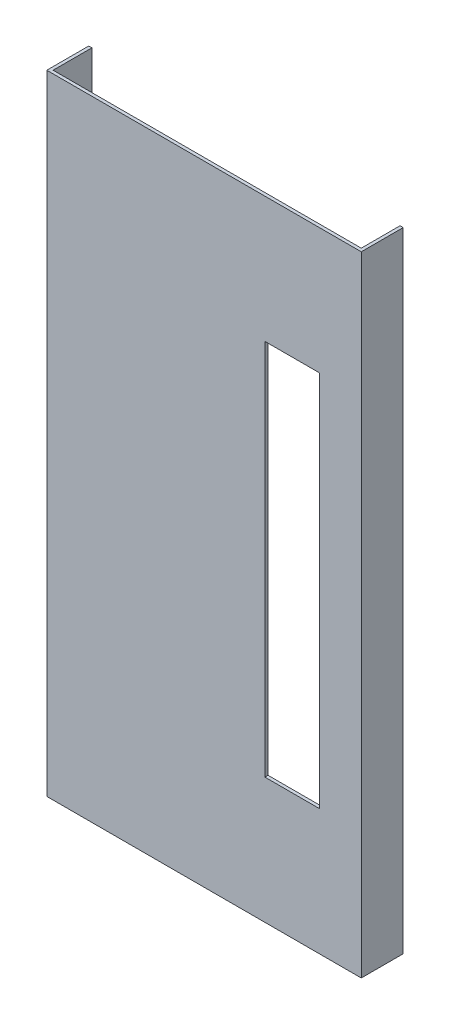
ISO-10303-21;
HEADER;
FILE_DESCRIPTION(('STEP AP214'),'2;1');
FILE_NAME('part.step','',(''),(''),'','','');
FILE_SCHEMA(('AUTOMOTIVE_DESIGN { 1 0 10303 214 1 1 1 1 }'));
ENDSEC;
DATA;
#1=APPLICATION_CONTEXT('core data for automotive mechanical design processes');
#2=APPLICATION_PROTOCOL_DEFINITION('international standard','automotive_design',2000,#1);
#3=PRODUCT_CONTEXT('',#1,'mechanical');
#4=PRODUCT('Part','Part','',(#3));
#5=PRODUCT_RELATED_PRODUCT_CATEGORY('part','',(#4));
#6=PRODUCT_DEFINITION_FORMATION('','',#4);
#7=PRODUCT_DEFINITION_CONTEXT('part definition',#1,'design');
#8=PRODUCT_DEFINITION('design','',#6,#7);
#9=PRODUCT_DEFINITION_SHAPE('','',#8);
#10=(LENGTH_UNIT() NAMED_UNIT(*) SI_UNIT(.MILLI.,.METRE.));
#11=(NAMED_UNIT(*) PLANE_ANGLE_UNIT() SI_UNIT($,.RADIAN.));
#12=(NAMED_UNIT(*) SI_UNIT($,.STERADIAN.) SOLID_ANGLE_UNIT());
#13=UNCERTAINTY_MEASURE_WITH_UNIT(LENGTH_MEASURE(1.E-05),#10,'distance_accuracy_value','');
#14=(GEOMETRIC_REPRESENTATION_CONTEXT(3) GLOBAL_UNCERTAINTY_ASSIGNED_CONTEXT((#13)) GLOBAL_UNIT_ASSIGNED_CONTEXT((#10,
#11,#12)) REPRESENTATION_CONTEXT('',''));
#15=CARTESIAN_POINT('',(0.,0.,0.));
#16=DIRECTION('',(0.,0.,1.));
#17=DIRECTION('',(1.,0.,0.));
#18=AXIS2_PLACEMENT_3D('',#15,#16,#17);
#19=CARTESIAN_POINT('',(180.,1120.,40.));
#20=DIRECTION('',(0.,0.,-1.));
#21=DIRECTION('',(-1.,0.,0.));
#22=AXIS2_PLACEMENT_3D('',#19,#20,#21);
#23=PLANE('',#22);
#24=DIRECTION('',(1.,0.,0.));
#25=VECTOR('',#24,1.);
#26=CARTESIAN_POINT('',(180.,820.,40.));
#27=LINE('',#26,#25);
#28=CARTESIAN_POINT('',(30.,820.,40.));
#29=VERTEX_POINT('',#28);
#30=CARTESIAN_POINT('',(180.,820.,40.));
#31=VERTEX_POINT('',#30);
#32=EDGE_CURVE('E141',#29,#31,#27,.T.);
#33=ORIENTED_EDGE('',*,*,#32,.T.);
#34=DIRECTION('',(0.,-1.,0.));
#35=VECTOR('',#34,1.);
#36=CARTESIAN_POINT('',(180.,1120.,40.));
#37=LINE('',#36,#35);
#38=CARTESIAN_POINT('',(180.,1120.,40.));
#39=VERTEX_POINT('',#38);
#40=EDGE_CURVE('E200',#39,#31,#37,.T.);
#41=ORIENTED_EDGE('',*,*,#40,.F.);
#42=DIRECTION('',(1.,0.,0.));
#43=VECTOR('',#42,1.);
#44=CARTESIAN_POINT('',(180.,1120.,40.));
#45=LINE('',#44,#43);
#46=CARTESIAN_POINT('',(30.,1120.,40.));
#47=VERTEX_POINT('',#46);
#48=EDGE_CURVE('E149',#47,#39,#45,.T.);
#49=ORIENTED_EDGE('',*,*,#48,.F.);
#50=DIRECTION('',(0.,-1.,0.));
#51=VECTOR('',#50,1.);
#52=CARTESIAN_POINT('',(30.,1120.,40.));
#53=LINE('',#52,#51);
#54=EDGE_CURVE('E166',#47,#29,#53,.T.);
#55=ORIENTED_EDGE('',*,*,#54,.T.);
#56=EDGE_LOOP('',(#33,#41,#49,#55));
#57=FACE_BOUND('',#56,.T.);
#58=DIRECTION('',(0.,-1.,0.));
#59=VECTOR('',#58,1.);
#60=CARTESIAN_POINT('',(134.,1120.,40.));
#61=LINE('',#60,#59);
#62=CARTESIAN_POINT('',(134.,1060.,40.));
#63=VERTEX_POINT('',#62);
#64=CARTESIAN_POINT('',(134.,880.,40.));
#65=VERTEX_POINT('',#64);
#66=EDGE_CURVE('E134',#63,#65,#61,.T.);
#67=ORIENTED_EDGE('',*,*,#66,.F.);
#68=DIRECTION('',(-1.,0.,0.));
#69=VECTOR('',#68,1.);
#70=CARTESIAN_POINT('',(180.,1060.,40.));
#71=LINE('',#70,#69);
#72=CARTESIAN_POINT('',(160.,1060.,40.));
#73=VERTEX_POINT('',#72);
#74=EDGE_CURVE('E123',#73,#63,#71,.T.);
#75=ORIENTED_EDGE('',*,*,#74,.F.);
#76=DIRECTION('',(0.,1.,0.));
#77=VECTOR('',#76,1.);
#78=CARTESIAN_POINT('',(160.,1120.,40.));
#79=LINE('',#78,#77);
#80=CARTESIAN_POINT('',(160.,880.,40.));
#81=VERTEX_POINT('',#80);
#82=EDGE_CURVE('E128',#81,#73,#79,.T.);
#83=ORIENTED_EDGE('',*,*,#82,.F.);
#84=DIRECTION('',(1.,0.,0.));
#85=VECTOR('',#84,1.);
#86=CARTESIAN_POINT('',(180.,880.,40.));
#87=LINE('',#86,#85);
#88=EDGE_CURVE('E140',#65,#81,#87,.T.);
#89=ORIENTED_EDGE('',*,*,#88,.F.);
#90=EDGE_LOOP('',(#67,#75,#83,#89));
#91=FACE_BOUND('',#90,.T.);
#92=ADVANCED_FACE('F39',(#57,#91),#23,.F.);
#93=CARTESIAN_POINT('',(31.5,1120.,38.5));
#94=DIRECTION('',(0.,0.,1.));
#95=DIRECTION('',(1.,0.,0.));
#96=AXIS2_PLACEMENT_3D('',#93,#94,#95);
#97=PLANE('',#96);
#98=DIRECTION('',(-1.,0.,0.));
#99=VECTOR('',#98,1.);
#100=CARTESIAN_POINT('',(31.5,820.,38.5));
#101=LINE('',#100,#99);
#102=CARTESIAN_POINT('',(178.5,820.,38.5));
#103=VERTEX_POINT('',#102);
#104=CARTESIAN_POINT('',(31.5,820.,38.5));
#105=VERTEX_POINT('',#104);
#106=EDGE_CURVE('E173',#103,#105,#101,.T.);
#107=ORIENTED_EDGE('',*,*,#106,.T.);
#108=DIRECTION('',(0.,-1.,0.));
#109=VECTOR('',#108,1.);
#110=CARTESIAN_POINT('',(31.5,1120.,38.5));
#111=LINE('',#110,#109);
#112=CARTESIAN_POINT('',(31.5,1120.,38.5));
#113=VERTEX_POINT('',#112);
#114=EDGE_CURVE('E188',#113,#105,#111,.T.);
#115=ORIENTED_EDGE('',*,*,#114,.F.);
#116=DIRECTION('',(-1.,0.,0.));
#117=VECTOR('',#116,1.);
#118=CARTESIAN_POINT('',(31.5,1120.,38.5));
#119=LINE('',#118,#117);
#120=CARTESIAN_POINT('',(178.5,1120.,38.5));
#121=VERTEX_POINT('',#120);
#122=EDGE_CURVE('E159',#121,#113,#119,.T.);
#123=ORIENTED_EDGE('',*,*,#122,.F.);
#124=DIRECTION('',(0.,-1.,0.));
#125=VECTOR('',#124,1.);
#126=CARTESIAN_POINT('',(178.5,1120.,38.5));
#127=LINE('',#126,#125);
#128=EDGE_CURVE('E191',#121,#103,#127,.T.);
#129=ORIENTED_EDGE('',*,*,#128,.T.);
#130=EDGE_LOOP('',(#107,#115,#123,#129));
#131=FACE_BOUND('',#130,.T.);
#132=DIRECTION('',(0.,1.,0.));
#133=VECTOR('',#132,1.);
#134=CARTESIAN_POINT('',(134.,1120.,38.5));
#135=LINE('',#134,#133);
#136=CARTESIAN_POINT('',(134.,880.,38.5));
#137=VERTEX_POINT('',#136);
#138=CARTESIAN_POINT('',(134.,1060.,38.5));
#139=VERTEX_POINT('',#138);
#140=EDGE_CURVE('E11',#137,#139,#135,.T.);
#141=ORIENTED_EDGE('',*,*,#140,.F.);
#142=DIRECTION('',(-1.,0.,0.));
#143=VECTOR('',#142,1.);
#144=CARTESIAN_POINT('',(31.5,880.,38.5));
#145=LINE('',#144,#143);
#146=CARTESIAN_POINT('',(160.,880.,38.5));
#147=VERTEX_POINT('',#146);
#148=EDGE_CURVE('E46',#147,#137,#145,.T.);
#149=ORIENTED_EDGE('',*,*,#148,.F.);
#150=DIRECTION('',(0.,-1.,0.));
#151=VECTOR('',#150,1.);
#152=CARTESIAN_POINT('',(160.,1120.,38.5));
#153=LINE('',#152,#151);
#154=CARTESIAN_POINT('',(160.,1060.,38.5));
#155=VERTEX_POINT('',#154);
#156=EDGE_CURVE('E205',#155,#147,#153,.T.);
#157=ORIENTED_EDGE('',*,*,#156,.F.);
#158=DIRECTION('',(1.,0.,0.));
#159=VECTOR('',#158,1.);
#160=CARTESIAN_POINT('',(31.5,1060.,38.5));
#161=LINE('',#160,#159);
#162=EDGE_CURVE('E203',#139,#155,#161,.T.);
#163=ORIENTED_EDGE('',*,*,#162,.F.);
#164=EDGE_LOOP('',(#141,#149,#157,#163));
#165=FACE_BOUND('',#164,.T.);
#166=ADVANCED_FACE('F215',(#131,#165),#97,.F.);
#167=CARTESIAN_POINT('',(180.,1120.,20.));
#168=DIRECTION('',(-1.,0.,0.));
#169=DIRECTION('',(0.,0.,1.));
#170=AXIS2_PLACEMENT_3D('',#167,#168,#169);
#171=PLANE('',#170);
#172=DIRECTION('',(0.,0.,-1.));
#173=VECTOR('',#172,1.);
#174=CARTESIAN_POINT('',(180.,820.,20.));
#175=LINE('',#174,#173);
#176=CARTESIAN_POINT('',(180.,820.,20.));
#177=VERTEX_POINT('',#176);
#178=EDGE_CURVE('E144',#31,#177,#175,.T.);
#179=ORIENTED_EDGE('',*,*,#178,.T.);
#180=DIRECTION('',(0.,-1.,0.));
#181=VECTOR('',#180,1.);
#182=CARTESIAN_POINT('',(180.,1120.,20.));
#183=LINE('',#182,#181);
#184=CARTESIAN_POINT('',(180.,1120.,20.));
#185=VERTEX_POINT('',#184);
#186=EDGE_CURVE('E197',#185,#177,#183,.T.);
#187=ORIENTED_EDGE('',*,*,#186,.F.);
#188=DIRECTION('',(0.,0.,-1.));
#189=VECTOR('',#188,1.);
#190=CARTESIAN_POINT('',(180.,1120.,20.));
#191=LINE('',#190,#189);
#192=EDGE_CURVE('E152',#39,#185,#191,.T.);
#193=ORIENTED_EDGE('',*,*,#192,.F.);
#194=ORIENTED_EDGE('',*,*,#40,.T.);
#195=EDGE_LOOP('',(#179,#187,#193,#194));
#196=FACE_BOUND('',#195,.T.);
#197=ADVANCED_FACE('F234',(#196),#171,.F.);
#198=CARTESIAN_POINT('',(178.5,1120.,20.));
#199=DIRECTION('',(0.,0.,1.));
#200=DIRECTION('',(1.,0.,0.));
#201=AXIS2_PLACEMENT_3D('',#198,#199,#200);
#202=PLANE('',#201);
#203=DIRECTION('',(-1.,0.,0.));
#204=VECTOR('',#203,1.);
#205=CARTESIAN_POINT('',(178.5,820.,20.));
#206=LINE('',#205,#204);
#207=CARTESIAN_POINT('',(178.5,820.,20.));
#208=VERTEX_POINT('',#207);
#209=EDGE_CURVE('E169',#177,#208,#206,.T.);
#210=ORIENTED_EDGE('',*,*,#209,.T.);
#211=DIRECTION('',(0.,-1.,0.));
#212=VECTOR('',#211,1.);
#213=CARTESIAN_POINT('',(178.5,1120.,20.));
#214=LINE('',#213,#212);
#215=CARTESIAN_POINT('',(178.5,1120.,20.));
#216=VERTEX_POINT('',#215);
#217=EDGE_CURVE('E194',#216,#208,#214,.T.);
#218=ORIENTED_EDGE('',*,*,#217,.F.);
#219=DIRECTION('',(-1.,0.,0.));
#220=VECTOR('',#219,1.);
#221=CARTESIAN_POINT('',(178.5,1120.,20.));
#222=LINE('',#221,#220);
#223=EDGE_CURVE('E155',#185,#216,#222,.T.);
#224=ORIENTED_EDGE('',*,*,#223,.F.);
#225=ORIENTED_EDGE('',*,*,#186,.T.);
#226=EDGE_LOOP('',(#210,#218,#224,#225));
#227=FACE_BOUND('',#226,.T.);
#228=ADVANCED_FACE('F273',(#227),#202,.F.);
#229=CARTESIAN_POINT('',(178.5,1120.,38.5));
#230=DIRECTION('',(1.,0.,0.));
#231=DIRECTION('',(0.,0.,-1.));
#232=AXIS2_PLACEMENT_3D('',#229,#230,#231);
#233=PLANE('',#232);
#234=DIRECTION('',(0.,0.,1.));
#235=VECTOR('',#234,1.);
#236=CARTESIAN_POINT('',(178.5,820.,38.5));
#237=LINE('',#236,#235);
#238=EDGE_CURVE('E171',#208,#103,#237,.T.);
#239=ORIENTED_EDGE('',*,*,#238,.T.);
#240=ORIENTED_EDGE('',*,*,#128,.F.);
#241=DIRECTION('',(0.,0.,1.));
#242=VECTOR('',#241,1.);
#243=CARTESIAN_POINT('',(178.5,1120.,38.5));
#244=LINE('',#243,#242);
#245=EDGE_CURVE('E157',#216,#121,#244,.T.);
#246=ORIENTED_EDGE('',*,*,#245,.F.);
#247=ORIENTED_EDGE('',*,*,#217,.T.);
#248=EDGE_LOOP('',(#239,#240,#246,#247));
#249=FACE_BOUND('',#248,.T.);
#250=ADVANCED_FACE('F270',(#249),#233,.F.);
#251=CARTESIAN_POINT('',(31.5,1120.,20.));
#252=DIRECTION('',(-1.,0.,0.));
#253=DIRECTION('',(0.,0.,1.));
#254=AXIS2_PLACEMENT_3D('',#251,#252,#253);
#255=PLANE('',#254);
#256=DIRECTION('',(0.,0.,-1.));
#257=VECTOR('',#256,1.);
#258=CARTESIAN_POINT('',(31.5,820.,20.));
#259=LINE('',#258,#257);
#260=CARTESIAN_POINT('',(31.5,820.,20.));
#261=VERTEX_POINT('',#260);
#262=EDGE_CURVE('E175',#105,#261,#259,.T.);
#263=ORIENTED_EDGE('',*,*,#262,.T.);
#264=DIRECTION('',(0.,-1.,0.));
#265=VECTOR('',#264,1.);
#266=CARTESIAN_POINT('',(31.5,1120.,20.));
#267=LINE('',#266,#265);
#268=CARTESIAN_POINT('',(31.5,1120.,20.));
#269=VERTEX_POINT('',#268);
#270=EDGE_CURVE('E185',#269,#261,#267,.T.);
#271=ORIENTED_EDGE('',*,*,#270,.F.);
#272=DIRECTION('',(0.,0.,-1.));
#273=VECTOR('',#272,1.);
#274=CARTESIAN_POINT('',(31.5,1120.,20.));
#275=LINE('',#274,#273);
#276=EDGE_CURVE('E161',#113,#269,#275,.T.);
#277=ORIENTED_EDGE('',*,*,#276,.F.);
#278=ORIENTED_EDGE('',*,*,#114,.T.);
#279=EDGE_LOOP('',(#263,#271,#277,#278));
#280=FACE_BOUND('',#279,.T.);
#281=ADVANCED_FACE('F263',(#280),#255,.F.);
#282=CARTESIAN_POINT('',(30.,1120.,20.));
#283=DIRECTION('',(0.,0.,1.));
#284=DIRECTION('',(1.,0.,0.));
#285=AXIS2_PLACEMENT_3D('',#282,#283,#284);
#286=PLANE('',#285);
#287=DIRECTION('',(-1.,0.,0.));
#288=VECTOR('',#287,1.);
#289=CARTESIAN_POINT('',(30.,820.,20.));
#290=LINE('',#289,#288);
#291=CARTESIAN_POINT('',(30.,820.,20.));
#292=VERTEX_POINT('',#291);
#293=EDGE_CURVE('E177',#261,#292,#290,.T.);
#294=ORIENTED_EDGE('',*,*,#293,.T.);
#295=DIRECTION('',(0.,-1.,0.));
#296=VECTOR('',#295,1.);
#297=CARTESIAN_POINT('',(30.,1120.,20.));
#298=LINE('',#297,#296);
#299=CARTESIAN_POINT('',(30.,1120.,20.));
#300=VERTEX_POINT('',#299);
#301=EDGE_CURVE('E182',#300,#292,#298,.T.);
#302=ORIENTED_EDGE('',*,*,#301,.F.);
#303=DIRECTION('',(-1.,0.,0.));
#304=VECTOR('',#303,1.);
#305=CARTESIAN_POINT('',(30.,1120.,20.));
#306=LINE('',#305,#304);
#307=EDGE_CURVE('E163',#269,#300,#306,.T.);
#308=ORIENTED_EDGE('',*,*,#307,.F.);
#309=ORIENTED_EDGE('',*,*,#270,.T.);
#310=EDGE_LOOP('',(#294,#302,#308,#309));
#311=FACE_BOUND('',#310,.T.);
#312=ADVANCED_FACE('F258',(#311),#286,.F.);
#313=CARTESIAN_POINT('',(30.,1120.,40.));
#314=DIRECTION('',(1.,0.,0.));
#315=DIRECTION('',(0.,0.,-1.));
#316=AXIS2_PLACEMENT_3D('',#313,#314,#315);
#317=PLANE('',#316);
#318=DIRECTION('',(0.,0.,1.));
#319=VECTOR('',#318,1.);
#320=CARTESIAN_POINT('',(30.,820.,40.));
#321=LINE('',#320,#319);
#322=EDGE_CURVE('E153',#292,#29,#321,.T.);
#323=ORIENTED_EDGE('',*,*,#322,.T.);
#324=ORIENTED_EDGE('',*,*,#54,.F.);
#325=DIRECTION('',(0.,0.,1.));
#326=VECTOR('',#325,1.);
#327=CARTESIAN_POINT('',(30.,1120.,40.));
#328=LINE('',#327,#326);
#329=EDGE_CURVE('E165',#300,#47,#328,.T.);
#330=ORIENTED_EDGE('',*,*,#329,.F.);
#331=ORIENTED_EDGE('',*,*,#301,.T.);
#332=EDGE_LOOP('',(#323,#324,#330,#331));
#333=FACE_BOUND('',#332,.T.);
#334=ADVANCED_FACE('F256',(#333),#317,.F.);
#335=CARTESIAN_POINT('',(0.,1120.,0.));
#336=DIRECTION('',(0.,-1.,0.));
#337=DIRECTION('',(0.,0.,-1.));
#338=AXIS2_PLACEMENT_3D('',#335,#336,#337);
#339=PLANE('',#338);
#340=ORIENTED_EDGE('',*,*,#48,.T.);
#341=ORIENTED_EDGE('',*,*,#192,.T.);
#342=ORIENTED_EDGE('',*,*,#223,.T.);
#343=ORIENTED_EDGE('',*,*,#245,.T.);
#344=ORIENTED_EDGE('',*,*,#122,.T.);
#345=ORIENTED_EDGE('',*,*,#276,.T.);
#346=ORIENTED_EDGE('',*,*,#307,.T.);
#347=ORIENTED_EDGE('',*,*,#329,.T.);
#348=EDGE_LOOP('',(#340,#341,#342,#343,#344,#345,#346,#347));
#349=FACE_BOUND('',#348,.T.);
#350=ADVANCED_FACE('F251',(#349),#339,.F.);
#351=CARTESIAN_POINT('',(0.,820.,0.));
#352=DIRECTION('',(0.,-1.,0.));
#353=DIRECTION('',(0.,0.,-1.));
#354=AXIS2_PLACEMENT_3D('',#351,#352,#353);
#355=PLANE('',#354);
#356=ORIENTED_EDGE('',*,*,#32,.F.);
#357=ORIENTED_EDGE('',*,*,#322,.F.);
#358=ORIENTED_EDGE('',*,*,#293,.F.);
#359=ORIENTED_EDGE('',*,*,#262,.F.);
#360=ORIENTED_EDGE('',*,*,#106,.F.);
#361=ORIENTED_EDGE('',*,*,#238,.F.);
#362=ORIENTED_EDGE('',*,*,#209,.F.);
#363=ORIENTED_EDGE('',*,*,#178,.F.);
#364=EDGE_LOOP('',(#356,#357,#358,#359,#360,#361,#362,#363));
#365=FACE_BOUND('',#364,.T.);
#366=ADVANCED_FACE('F243',(#365),#355,.T.);
#367=CARTESIAN_POINT('',(134.,880.,41.));
#368=DIRECTION('',(1.,0.,0.));
#369=DIRECTION('',(0.,0.,-1.));
#370=AXIS2_PLACEMENT_3D('',#367,#368,#369);
#371=PLANE('',#370);
#372=ORIENTED_EDGE('',*,*,#66,.T.);
#373=DIRECTION('',(0.,0.,-1.));
#374=VECTOR('',#373,1.);
#375=CARTESIAN_POINT('',(134.,880.,41.));
#376=LINE('',#375,#374);
#377=EDGE_CURVE('E129',#65,#137,#376,.T.);
#378=ORIENTED_EDGE('',*,*,#377,.T.);
#379=ORIENTED_EDGE('',*,*,#140,.T.);
#380=DIRECTION('',(0.,0.,-1.));
#381=VECTOR('',#380,1.);
#382=CARTESIAN_POINT('',(134.,1060.,41.));
#383=LINE('',#382,#381);
#384=EDGE_CURVE('E58',#63,#139,#383,.T.);
#385=ORIENTED_EDGE('',*,*,#384,.F.);
#386=EDGE_LOOP('',(#372,#378,#379,#385));
#387=FACE_BOUND('',#386,.T.);
#388=ADVANCED_FACE('F132',(#387),#371,.T.);
#389=CARTESIAN_POINT('',(134.,880.,41.));
#390=DIRECTION('',(0.,1.,0.));
#391=DIRECTION('',(0.,0.,1.));
#392=AXIS2_PLACEMENT_3D('',#389,#390,#391);
#393=PLANE('',#392);
#394=ORIENTED_EDGE('',*,*,#88,.T.);
#395=DIRECTION('',(0.,0.,-1.));
#396=VECTOR('',#395,1.);
#397=CARTESIAN_POINT('',(160.,880.,41.));
#398=LINE('',#397,#396);
#399=EDGE_CURVE('E211',#81,#147,#398,.T.);
#400=ORIENTED_EDGE('',*,*,#399,.T.);
#401=ORIENTED_EDGE('',*,*,#148,.T.);
#402=ORIENTED_EDGE('',*,*,#377,.F.);
#403=EDGE_LOOP('',(#394,#400,#401,#402));
#404=FACE_BOUND('',#403,.T.);
#405=ADVANCED_FACE('F209',(#404),#393,.T.);
#406=CARTESIAN_POINT('',(160.,880.,41.));
#407=DIRECTION('',(-1.,0.,0.));
#408=DIRECTION('',(0.,0.,1.));
#409=AXIS2_PLACEMENT_3D('',#406,#407,#408);
#410=PLANE('',#409);
#411=ORIENTED_EDGE('',*,*,#82,.T.);
#412=DIRECTION('',(0.,0.,-1.));
#413=VECTOR('',#412,1.);
#414=CARTESIAN_POINT('',(160.,1060.,41.));
#415=LINE('',#414,#413);
#416=EDGE_CURVE('E53',#73,#155,#415,.T.);
#417=ORIENTED_EDGE('',*,*,#416,.T.);
#418=ORIENTED_EDGE('',*,*,#156,.T.);
#419=ORIENTED_EDGE('',*,*,#399,.F.);
#420=EDGE_LOOP('',(#411,#417,#418,#419));
#421=FACE_BOUND('',#420,.T.);
#422=ADVANCED_FACE('F217',(#421),#410,.T.);
#423=CARTESIAN_POINT('',(134.,1060.,41.));
#424=DIRECTION('',(0.,-1.,0.));
#425=DIRECTION('',(0.,0.,-1.));
#426=AXIS2_PLACEMENT_3D('',#423,#424,#425);
#427=PLANE('',#426);
#428=ORIENTED_EDGE('',*,*,#74,.T.);
#429=ORIENTED_EDGE('',*,*,#384,.T.);
#430=ORIENTED_EDGE('',*,*,#162,.T.);
#431=ORIENTED_EDGE('',*,*,#416,.F.);
#432=EDGE_LOOP('',(#428,#429,#430,#431));
#433=FACE_BOUND('',#432,.T.);
#434=ADVANCED_FACE('F124',(#433),#427,.T.);
#435=CLOSED_SHELL('',(#92,#166,#197,#228,#250,#281,#312,#334,#350,#366,#388,#405,#422,#434));
#436=MANIFOLD_SOLID_BREP('B2',#435);
#437=ADVANCED_BREP_SHAPE_REPRESENTATION('',(#18,#436),#14);
#438=SHAPE_DEFINITION_REPRESENTATION(#9,#437);
ENDSEC;
END-ISO-10303-21;
